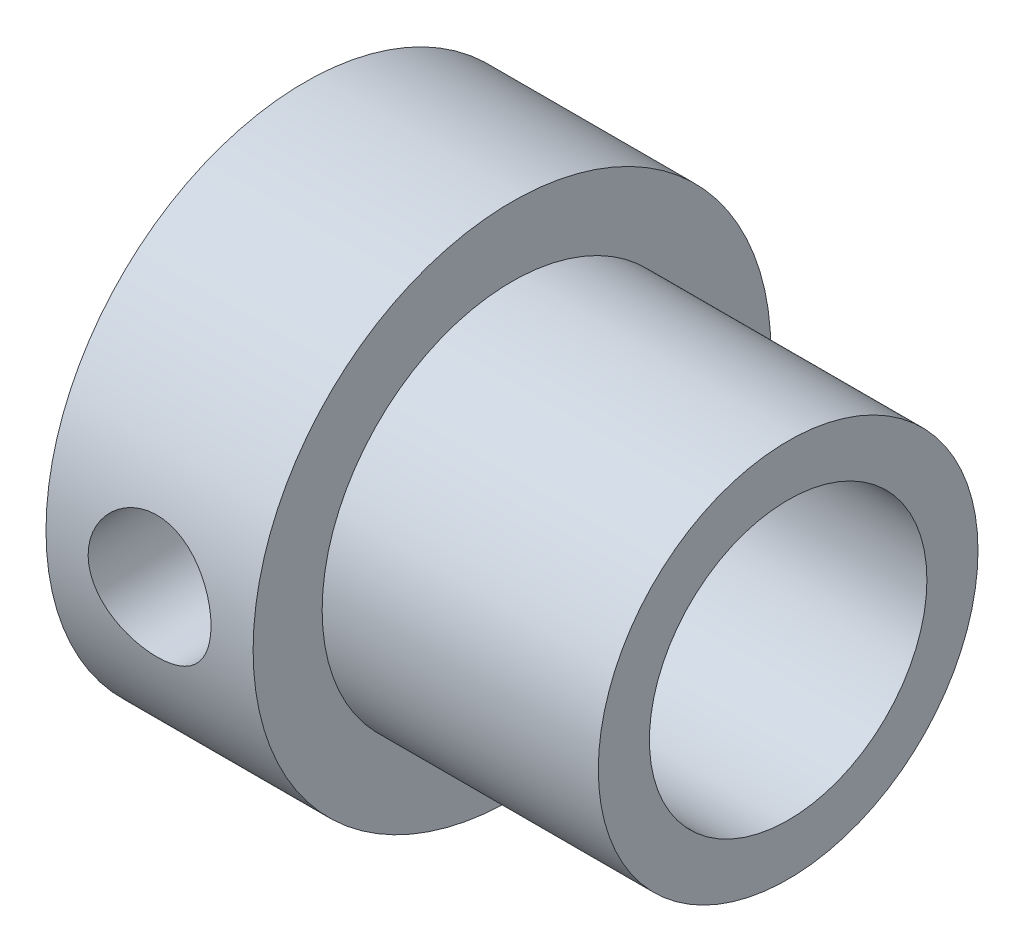
ISO-10303-21;
HEADER;
FILE_DESCRIPTION(('STEP AP214'),'2;1');
FILE_NAME('part.step','',(''),(''),'','','');
FILE_SCHEMA(('AUTOMOTIVE_DESIGN { 1 0 10303 214 1 1 1 1 }'));
ENDSEC;
DATA;
#1=APPLICATION_CONTEXT('core data for automotive mechanical design processes');
#2=APPLICATION_PROTOCOL_DEFINITION('international standard','automotive_design',2000,#1);
#3=PRODUCT_CONTEXT('',#1,'mechanical');
#4=PRODUCT('Part','Part','',(#3));
#5=PRODUCT_RELATED_PRODUCT_CATEGORY('part','',(#4));
#6=PRODUCT_DEFINITION_FORMATION('','',#4);
#7=PRODUCT_DEFINITION_CONTEXT('part definition',#1,'design');
#8=PRODUCT_DEFINITION('design','',#6,#7);
#9=PRODUCT_DEFINITION_SHAPE('','',#8);
#10=(LENGTH_UNIT() NAMED_UNIT(*) SI_UNIT(.MILLI.,.METRE.));
#11=(NAMED_UNIT(*) PLANE_ANGLE_UNIT() SI_UNIT($,.RADIAN.));
#12=(NAMED_UNIT(*) SI_UNIT($,.STERADIAN.) SOLID_ANGLE_UNIT());
#13=UNCERTAINTY_MEASURE_WITH_UNIT(LENGTH_MEASURE(1.E-05),#10,'distance_accuracy_value','');
#14=(GEOMETRIC_REPRESENTATION_CONTEXT(3) GLOBAL_UNCERTAINTY_ASSIGNED_CONTEXT((#13)) GLOBAL_UNIT_ASSIGNED_CONTEXT((#10,
#11,#12)) REPRESENTATION_CONTEXT('',''));
#15=CARTESIAN_POINT('',(0.,0.,0.));
#16=DIRECTION('',(0.,0.,1.));
#17=DIRECTION('',(1.,0.,0.));
#18=AXIS2_PLACEMENT_3D('',#15,#16,#17);
#19=CARTESIAN_POINT('',(8.89,0.,0.));
#20=DIRECTION('',(1.,0.,0.));
#21=DIRECTION('',(0.,0.,-1.));
#22=AXIS2_PLACEMENT_3D('',#19,#20,#21);
#23=PLANE('',#22);
#24=CARTESIAN_POINT('',(8.89,0.,0.));
#25=DIRECTION('',(1.,0.,0.));
#26=DIRECTION('',(0.,0.,-1.));
#27=AXIS2_PLACEMENT_3D('',#24,#25,#26);
#28=CIRCLE('',#27,3.4925);
#29=CARTESIAN_POINT('',(8.89,0.,-3.4925));
#30=VERTEX_POINT('',#29);
#31=EDGE_CURVE('E109',#30,#30,#28,.T.);
#32=ORIENTED_EDGE('',*,*,#31,.T.);
#33=EDGE_LOOP('',(#32));
#34=FACE_BOUND('',#33,.T.);
#35=CARTESIAN_POINT('',(8.89,0.,0.));
#36=DIRECTION('',(1.,0.,0.));
#37=DIRECTION('',(0.,0.,-1.));
#38=AXIS2_PLACEMENT_3D('',#35,#36,#37);
#39=CIRCLE('',#38,2.5527);
#40=CARTESIAN_POINT('',(8.89,0.,-2.5527));
#41=VERTEX_POINT('',#40);
#42=EDGE_CURVE('E45',#41,#41,#39,.T.);
#43=ORIENTED_EDGE('',*,*,#42,.F.);
#44=EDGE_LOOP('',(#43));
#45=FACE_BOUND('',#44,.T.);
#46=ADVANCED_FACE('F33',(#34,#45),#23,.T.);
#47=CARTESIAN_POINT('',(0.,0.,0.));
#48=DIRECTION('',(1.,0.,0.));
#49=DIRECTION('',(0.,0.,-1.));
#50=AXIS2_PLACEMENT_3D('',#47,#48,#49);
#51=PLANE('',#50);
#52=CARTESIAN_POINT('',(0.,0.,0.));
#53=DIRECTION('',(1.,0.,0.));
#54=DIRECTION('',(0.,0.,-1.));
#55=AXIS2_PLACEMENT_3D('',#52,#53,#54);
#56=CIRCLE('',#55,4.7625);
#57=CARTESIAN_POINT('',(0.,0.,-4.7625));
#58=VERTEX_POINT('',#57);
#59=EDGE_CURVE('E10',#58,#58,#56,.T.);
#60=ORIENTED_EDGE('',*,*,#59,.F.);
#61=EDGE_LOOP('',(#60));
#62=FACE_BOUND('',#61,.T.);
#63=CARTESIAN_POINT('',(0.,0.,0.));
#64=DIRECTION('',(1.,0.,0.));
#65=DIRECTION('',(0.,0.,-1.));
#66=AXIS2_PLACEMENT_3D('',#63,#64,#65);
#67=CIRCLE('',#66,2.5527);
#68=CARTESIAN_POINT('',(0.,0.,-2.5527));
#69=VERTEX_POINT('',#68);
#70=EDGE_CURVE('E50',#69,#69,#67,.T.);
#71=ORIENTED_EDGE('',*,*,#70,.T.);
#72=EDGE_LOOP('',(#71));
#73=FACE_BOUND('',#72,.T.);
#74=ADVANCED_FACE('F100',(#62,#73),#51,.F.);
#75=CARTESIAN_POINT('',(8.89,0.,0.));
#76=DIRECTION('',(-1.,0.,0.));
#77=DIRECTION('',(0.,0.,1.));
#78=AXIS2_PLACEMENT_3D('',#75,#76,#77);
#79=CYLINDRICAL_SURFACE('',#78,4.7625);
#80=CARTESIAN_POINT('',(3.03529999999999,0.,4.7625));
#81=CARTESIAN_POINT('',(3.03529807239149,-0.0625504471650139,4.76249888658254));
#82=CARTESIAN_POINT('',(3.03009021829286,-0.125123129283414,4.76125531619252));
#83=CARTESIAN_POINT('',(3.00942356035693,-0.248481844038287,4.75641479439014));
#84=CARTESIAN_POINT('',(2.99395831147164,-0.309266728250472,4.75281636336277));
#85=CARTESIAN_POINT('',(2.95329586247846,-0.427250047842575,4.74366551356278));
#86=CARTESIAN_POINT('',(2.92810971725876,-0.484452471724355,4.73811531503235));
#87=CARTESIAN_POINT('',(2.86875774840629,-0.593819309373723,4.72565533763748));
#88=CARTESIAN_POINT('',(2.83459184246671,-0.645983676957435,4.71874554631142));
#89=CARTESIAN_POINT('',(2.75757488787853,-0.744769781920514,4.70417494660862));
#90=CARTESIAN_POINT('',(2.7145877648823,-0.791283867055914,4.69650348465821));
#91=CARTESIAN_POINT('',(2.62144029184914,-0.876514301242979,4.68134670992166));
#92=CARTESIAN_POINT('',(2.57127920799906,-0.915229851617912,4.67386141627044));
#93=CARTESIAN_POINT('',(2.4643886022683,-0.984257303274572,4.65981813018725));
#94=CARTESIAN_POINT('',(2.40758094945983,-1.01445122919643,4.6532737183417));
#95=CARTESIAN_POINT('',(2.28951628766717,-1.06482048280172,4.64200756588757));
#96=CARTESIAN_POINT('',(2.22825991492552,-1.08499723988878,4.63728556525076));
#97=CARTESIAN_POINT('',(2.10421390336463,-1.1143969583754,4.63030798184956));
#98=CARTESIAN_POINT('',(2.04147233950669,-1.12381226659384,4.62800914824604));
#99=CARTESIAN_POINT('',(1.91526132355056,-1.1320205269598,4.62600854277725));
#100=CARTESIAN_POINT('',(1.8517919788854,-1.1308150272652,4.62630639240253));
#101=CARTESIAN_POINT('',(1.72738235124524,-1.11796991019263,4.62942650333921));
#102=CARTESIAN_POINT('',(1.66641706945381,-1.10655703472154,4.63219390421103));
#103=CARTESIAN_POINT('',(1.54729209319917,-1.07398179717215,4.63985416565765));
#104=CARTESIAN_POINT('',(1.4891325811751,-1.05281880205468,4.64474716423846));
#105=CARTESIAN_POINT('',(1.3766497691327,-1.00114461591173,4.65615920388045));
#106=CARTESIAN_POINT('',(1.32236675088252,-0.970549092235659,4.66269281104616));
#107=CARTESIAN_POINT('',(1.21962280407758,-0.900937448372102,4.6766413798207));
#108=CARTESIAN_POINT('',(1.1711628026646,-0.861919990000867,4.68405648140832));
#109=CARTESIAN_POINT('',(1.08013848903166,-0.775386694919819,4.69916539760802));
#110=CARTESIAN_POINT('',(1.03775685037753,-0.727678881710187,4.70686148789115));
#111=CARTESIAN_POINT('',(0.961563027387468,-0.625742654598686,4.72149336042034));
#112=CARTESIAN_POINT('',(0.927751056466081,-0.571514078356698,4.72842912372918));
#113=CARTESIAN_POINT('',(0.869598634956746,-0.457830918707979,4.7407880498009));
#114=CARTESIAN_POINT('',(0.84528543817999,-0.398361889110949,4.7462068476709));
#115=CARTESIAN_POINT('',(0.80705015590794,-0.276024255491213,4.75488931700387));
#116=CARTESIAN_POINT('',(0.793126284237203,-0.21315623783065,4.75815335891022));
#117=CARTESIAN_POINT('',(0.776338279169921,-0.0873691590361518,4.76210460266796));
#118=CARTESIAN_POINT('',(0.773225069078427,-0.02448511596067,4.76284982691246));
#119=CARTESIAN_POINT('',(0.777466989421545,0.100904914262536,4.76184360723796));
#120=CARTESIAN_POINT('',(0.784821276170571,0.16341093147156,4.76009236453545));
#121=CARTESIAN_POINT('',(0.809583534682482,0.285421966304748,4.75432693440289));
#122=CARTESIAN_POINT('',(0.826857821394571,0.344955665814232,4.75034285425274));
#123=CARTESIAN_POINT('',(0.870818845652645,0.460278770394102,4.74055923690497));
#124=CARTESIAN_POINT('',(0.897506476042742,0.516067819691336,4.73475952750301));
#125=CARTESIAN_POINT('',(0.960034462531483,0.623325436186186,4.72184709836335));
#126=CARTESIAN_POINT('',(0.996017197145451,0.674708549514258,4.71471447952687));
#127=CARTESIAN_POINT('',(1.07592972675077,0.770796159921666,4.69996242077331));
#128=CARTESIAN_POINT('',(1.11986075028937,0.815499622590926,4.69234290571582));
#129=CARTESIAN_POINT('',(1.2155741125064,0.897968165505122,4.6772704338935));
#130=CARTESIAN_POINT('',(1.2675076328207,0.935559392964989,4.66982480514445));
#131=CARTESIAN_POINT('',(1.37709495613261,1.00149022808019,4.65613164810589));
#132=CARTESIAN_POINT('',(1.43474850300898,1.0298302497261,4.64988406620905));
#133=CARTESIAN_POINT('',(1.55382459697879,1.0762491323619,4.63935996173661));
#134=CARTESIAN_POINT('',(1.61522255286585,1.09438832132569,4.63507187952516));
#135=CARTESIAN_POINT('',(1.74031220674057,1.12005827002545,4.62893650286401));
#136=CARTESIAN_POINT('',(1.80400345879796,1.12759108086312,4.62708873650105));
#137=CARTESIAN_POINT('',(1.93010978036334,1.13173541942954,4.62607660378741));
#138=CARTESIAN_POINT('',(1.9925153584529,1.12862381464115,4.62684420801562));
#139=CARTESIAN_POINT('',(2.11588506708796,1.11219513075476,4.63082047949845));
#140=CARTESIAN_POINT('',(2.17684922125018,1.09887821898312,4.63402910673));
#141=CARTESIAN_POINT('',(2.29533856889195,1.06256106322214,4.64248992098927));
#142=CARTESIAN_POINT('',(2.35287894380876,1.03960787796392,4.64773216751233));
#143=CARTESIAN_POINT('',(2.46333073212595,0.984707919621938,4.65967190423071));
#144=CARTESIAN_POINT('',(2.51624156713508,0.95276002488178,4.66636957589639));
#145=CARTESIAN_POINT('',(2.61728172085009,0.879888490013,4.68066337542781));
#146=CARTESIAN_POINT('',(2.66526843242637,0.83877051437427,4.68827700003745));
#147=CARTESIAN_POINT('',(2.75375116750188,0.749111183772152,4.7034351287937));
#148=CARTESIAN_POINT('',(2.79424543377222,0.700568092234966,4.71097961633199));
#149=CARTESIAN_POINT('',(2.86721635688837,0.596506539598589,4.72529205111388));
#150=CARTESIAN_POINT('',(2.89955551187321,0.540889568123418,4.73204576758136));
#151=CARTESIAN_POINT('',(2.95437395279317,0.424856108392295,4.74386898028089));
#152=CARTESIAN_POINT('',(2.97686081846655,0.364443352132297,4.74893977052069));
#153=CARTESIAN_POINT('',(3.00771353998029,0.253386137402228,4.75601012346783));
#154=CARTESIAN_POINT('',(3.01803723707078,0.203302998812327,4.75842781496556));
#155=CARTESIAN_POINT('',(3.03183104555365,0.102151476578724,4.76167315947544));
#156=CARTESIAN_POINT('',(3.03530157422248,0.051083153112265,4.76250090929605));
#157=CARTESIAN_POINT('',(3.03529999999999,0.,4.7625));
#158=B_SPLINE_CURVE_WITH_KNOTS('',3,(#80,#81,#82,#83,#84,#85,#86,#87,#88,#89,#90,#91,#92,#93,
#94,#95,#96,#97,#98,#99,#100,#101,#102,#103,#104,#105,#106,#107,#108,#109,#110,#111,#112,#113,
#114,#115,#116,#117,#118,#119,#120,#121,#122,#123,#124,#125,#126,#127,#128,#129,#130,#131,#132,
#133,#134,#135,#136,#137,#138,#139,#140,#141,#142,#143,#144,#145,#146,#147,#148,#149,#150,#151,
#152,#153,#154,#155,#156,#157),.UNSPECIFIED.,.T.,.F.,(4,2,2,2,2,2,2,2,2,2,2,2,2,2,2,2,2,2,2,2,2,
2,2,2,2,2,2,2,2,2,2,2,2,2,2,2,2,2,4),(0.,0.187464233445307,0.375046368371232,0.562415804978716,
0.749786959039261,0.940301149532551,1.13083484137834,1.323889669599,1.51691694186556,
1.7064373300301,1.8959300929301,2.08131531006456,2.26671256527164,2.45381796865748,
2.64095312363525,2.83287860741466,3.02480887033708,3.21728584337237,3.40972971734638,
3.59770916783964,3.78567346795126,3.97116223372721,4.15666859761833,4.34520498082454,
4.53377053056521,4.72647545534146,4.91917175540808,5.1107161261548,5.30222345023355,
5.48878783947732,5.67534916987397,5.86100983556768,6.04669366374171,6.23676713117165,
6.42688512083306,6.62002158350616,6.81300919697149,6.96611517316011,7.11921182672834),.UNSPECIFIED.);
#159=CARTESIAN_POINT('',(3.03529999999999,0.,4.7625));
#160=VERTEX_POINT('',#159);
#161=EDGE_CURVE('E87',#160,#160,#158,.T.);
#162=ORIENTED_EDGE('',*,*,#161,.T.);
#163=EDGE_LOOP('',(#162));
#164=FACE_BOUND('',#163,.T.);
#165=CARTESIAN_POINT('',(1.905,-3.3214430575241,-3.413125));
#166=CARTESIAN_POINT('',(1.92239034401591,-3.32144338598432,-3.41312464634439));
#167=CARTESIAN_POINT('',(1.9397787414522,-3.32026081542799,-3.41427666636538));
#168=CARTESIAN_POINT('',(1.97395400258613,-3.31562276717464,-3.41878078138937));
#169=CARTESIAN_POINT('',(1.99074066982091,-3.31216655414177,-3.42213358816465));
#170=CARTESIAN_POINT('',(2.02312767048979,-3.30324677602216,-3.43074401766534));
#171=CARTESIAN_POINT('',(2.03873448716385,-3.29779531617929,-3.43599015088018));
#172=CARTESIAN_POINT('',(2.06858387778067,-3.28518677251326,-3.44804731415635));
#173=CARTESIAN_POINT('',(2.08282578029641,-3.27802885522817,-3.45485910885403));
#174=CARTESIAN_POINT('',(2.11509105279419,-3.25923213384868,-3.47261232738866));
#175=CARTESIAN_POINT('',(2.13241515241901,-3.24693568967856,-3.4841269595581));
#176=CARTESIAN_POINT('',(2.16414193459527,-3.22032780613654,-3.50873567923749));
#177=CARTESIAN_POINT('',(2.17853858438573,-3.20601230670761,-3.52183294141597));
#178=CARTESIAN_POINT('',(2.21034476020084,-3.16923494255587,-3.55502540489891));
#179=CARTESIAN_POINT('',(2.22626746028777,-3.14597187285453,-3.57565216335787));
#180=CARTESIAN_POINT('',(2.25310837678037,-3.09745752188421,-3.61776249375936));
#181=CARTESIAN_POINT('',(2.26401746715057,-3.07220271223861,-3.63924755139315));
#182=CARTESIAN_POINT('',(2.28583423970741,-3.00758272579165,-3.69301687162644));
#183=CARTESIAN_POINT('',(2.29408438772789,-2.96740471084196,-3.7253980082838));
#184=CARTESIAN_POINT('',(2.30263692602349,-2.88548985832329,-3.78920445830923));
#185=CARTESIAN_POINT('',(2.30292417041481,-2.84375020132706,-3.82062783664003));
#186=CARTESIAN_POINT('',(2.29640051141597,-2.75790125668795,-3.88308103972661));
#187=CARTESIAN_POINT('',(2.28929803326688,-2.71376498858693,-3.91404187778891));
#188=CARTESIAN_POINT('',(2.26795418822904,-2.62572112101903,-3.97363922110816));
#189=CARTESIAN_POINT('',(2.25372479737792,-2.58181326237924,-4.00227953228438));
#190=CARTESIAN_POINT('',(2.22466821562537,-2.51235877410809,-4.0460387951184));
#191=CARTESIAN_POINT('',(2.21225860599925,-2.4863570900501,-4.06205964259837));
#192=CARTESIAN_POINT('',(2.18417872092098,-2.43533400341371,-4.09285187028729));
#193=CARTESIAN_POINT('',(2.16850852246134,-2.41031257770499,-4.10762327998772));
#194=CARTESIAN_POINT('',(2.13789186319249,-2.36858809838528,-4.1317811950879));
#195=CARTESIAN_POINT('',(2.12386057879948,-2.35144207234751,-4.141555266608));
#196=CARTESIAN_POINT('',(2.0931996743799,-2.31888511543925,-4.15987045320255));
#197=CARTESIAN_POINT('',(2.0765769733352,-2.30346974706477,-4.16841473817517));
#198=CARTESIAN_POINT('',(2.0479262784848,-2.28157672142087,-4.18041850455823));
#199=CARTESIAN_POINT('',(2.03694193150532,-2.27408228589597,-4.18449710237343));
#200=CARTESIAN_POINT('',(2.0138689691845,-2.26051411574797,-4.191842221902));
#201=CARTESIAN_POINT('',(2.00178183687321,-2.2544385111243,-4.19510981287288));
#202=CARTESIAN_POINT('',(1.97882784387124,-2.24514191127608,-4.20009131246604));
#203=CARTESIAN_POINT('',(1.96812893569308,-2.24160480758647,-4.20197852141112));
#204=CARTESIAN_POINT('',(1.94621185847569,-2.23615061096609,-4.20488364068707));
#205=CARTESIAN_POINT('',(1.93499431005452,-2.23423163209288,-4.20590256303033));
#206=CARTESIAN_POINT('',(1.91228731464648,-2.23221846165825,-4.20697141450907));
#207=CARTESIAN_POINT('',(1.90079677635363,-2.23213358423556,-4.20701639768018));
#208=CARTESIAN_POINT('',(1.87799192992963,-2.23382269614555,-4.20611973060678));
#209=CARTESIAN_POINT('',(1.86667772808199,-2.23559776565571,-4.2051775070349));
#210=CARTESIAN_POINT('',(1.8430687481648,-2.24115748687566,-4.20221730298505));
#211=CARTESIAN_POINT('',(1.8308474995612,-2.24518086438047,-4.20007138390426));
#212=CARTESIAN_POINT('',(1.80731134338365,-2.25491349165417,-4.19485421354974));
#213=CARTESIAN_POINT('',(1.7959981005701,-2.26062575196372,-4.19178130966645));
#214=CARTESIAN_POINT('',(1.76849574876853,-2.27671571372701,-4.18307219674323));
#215=CARTESIAN_POINT('',(1.75296816247342,-2.28794796868523,-4.17694740443182));
#216=CARTESIAN_POINT('',(1.72398691235816,-2.31223528905542,-4.16355252146381));
#217=CARTESIAN_POINT('',(1.7105388805811,-2.32529512819918,-4.15627942479059));
#218=CARTESIAN_POINT('',(1.67465444619536,-2.36419280830635,-4.13434768281549));
#219=CARTESIAN_POINT('',(1.65435143115705,-2.39141722848185,-4.11868673816691));
#220=CARTESIAN_POINT('',(1.61829458416809,-2.44766595387083,-4.08551334686455));
#221=CARTESIAN_POINT('',(1.60255407385912,-2.47669523510611,-4.06799567831147));
#222=CARTESIAN_POINT('',(1.57719686465704,-2.53075747491538,-4.03453945113107));
#223=CARTESIAN_POINT('',(1.56699765373351,-2.55565573285649,-4.01882009430176));
#224=CARTESIAN_POINT('',(1.5490557045636,-2.60577429844982,-3.9865071967658));
#225=CARTESIAN_POINT('',(1.54131456525801,-2.63099480467137,-3.96991309519857));
#226=CARTESIAN_POINT('',(1.5216384028753,-2.70680859236329,-3.91896428365634));
#227=CARTESIAN_POINT('',(1.51323665727136,-2.75758517173021,-3.88342397257778));
#228=CARTESIAN_POINT('',(1.50701328930841,-2.8493816765294,-3.81642390743077));
#229=CARTESIAN_POINT('',(1.50761050886178,-2.8905675123375,-3.78532431891019));
#230=CARTESIAN_POINT('',(1.51664373656484,-2.97135732556234,-3.72223602539841));
#231=CARTESIAN_POINT('',(1.52505896182396,-3.01096520670335,-3.69024989575659));
#232=CARTESIAN_POINT('',(1.54641988378006,-3.07299164027436,-3.63855811141447));
#233=CARTESIAN_POINT('',(1.55649582605072,-3.09630079649555,-3.61873179054424));
#234=CARTESIAN_POINT('',(1.58090739348323,-3.14125149129612,-3.5797796162485));
#235=CARTESIAN_POINT('',(1.59523825020348,-3.16289486269341,-3.5606530054744));
#236=CARTESIAN_POINT('',(1.62454647953806,-3.19859687841671,-3.52857067890691));
#237=CARTESIAN_POINT('',(1.63847119403741,-3.21320091475058,-3.51526563807507));
#238=CARTESIAN_POINT('',(1.66923964746582,-3.2404900455096,-3.49012500024243));
#239=CARTESIAN_POINT('',(1.68607881465219,-3.25317808793733,-3.4782871509156));
#240=CARTESIAN_POINT('',(1.71844497508146,-3.27331915694858,-3.45932562435078));
#241=CARTESIAN_POINT('',(1.73337090377999,-3.28130387234286,-3.45174531647719));
#242=CARTESIAN_POINT('',(1.7648227585606,-3.29537697193551,-3.43831230827551));
#243=CARTESIAN_POINT('',(1.78134765069539,-3.30146657098294,-3.43245850131426));
#244=CARTESIAN_POINT('',(1.81540099301617,-3.31129882501221,-3.42297429357845));
#245=CARTESIAN_POINT('',(1.83290969775609,-3.31507670747535,-3.4193105403625));
#246=CARTESIAN_POINT('',(1.86861327605329,-3.32014785738221,-3.41438684725993));
#247=CARTESIAN_POINT('',(1.88680770315243,-3.32144271391698,-3.41312536996438));
#248=CARTESIAN_POINT('',(1.905,-3.3214430575241,-3.413125));
#249=B_SPLINE_CURVE_WITH_KNOTS('',3,(#165,#166,#167,#168,#169,#170,#171,#172,#173,#174,#175,
#176,#177,#178,#179,#180,#181,#182,#183,#184,#185,#186,#187,#188,#189,#190,#191,#192,#193,#194,
#195,#196,#197,#198,#199,#200,#201,#202,#203,#204,#205,#206,#207,#208,#209,#210,#211,#212,#213,
#214,#215,#216,#217,#218,#219,#220,#221,#222,#223,#224,#225,#226,#227,#228,#229,#230,#231,#232,
#233,#234,#235,#236,#237,#238,#239,#240,#241,#242,#243,#244,#245,#246,#247,#248),.UNSPECIFIED.,
.T.,.F.,(4,2,2,2,2,2,2,2,2,2,2,2,2,2,2,2,2,2,2,2,2,2,2,2,2,2,2,2,2,2,2,2,2,2,2,2,2,2,2,2,2,4),
(0.,0.0520929257956746,0.10420270764563,0.156001440657767,0.207825525043841,0.279916403884979,
0.352154371590211,0.456365581665272,0.560765738380168,0.716687516045963,0.872905845262917,
1.03553061412887,1.19788302119736,1.29663890309776,1.39539245333346,1.46789144239799,
1.54020007639941,1.58182368656726,1.62339212378137,1.65753190155879,1.69163183383017,
1.72590489571195,1.76019787295745,1.79911553656464,1.83810299598666,1.89812002615789,
1.95829685587146,2.06987154766141,2.18176880817835,2.27512769486264,2.36854718636202,
2.55527039257444,2.7096356498369,2.86359172289491,2.95999283122121,3.05628630894216,
3.12856379054588,3.20072890532355,3.25616129003594,3.31155806671769,3.36608815907237,
3.42058334150617),.UNSPECIFIED.);
#250=CARTESIAN_POINT('',(1.905,-3.3214430575241,-3.413125));
#251=VERTEX_POINT('',#250);
#252=EDGE_CURVE('E38',#251,#251,#249,.T.);
#253=ORIENTED_EDGE('',*,*,#252,.T.);
#254=EDGE_LOOP('',(#253));
#255=FACE_BOUND('',#254,.T.);
#256=CARTESIAN_POINT('',(1.905,3.32144305752409,-3.413125));
#257=CARTESIAN_POINT('',(1.88760965598409,3.32144338598432,-3.41312464634439));
#258=CARTESIAN_POINT('',(1.8702212585478,3.32026081542799,-3.41427666636538));
#259=CARTESIAN_POINT('',(1.83604599741387,3.31562276717464,-3.41878078138937));
#260=CARTESIAN_POINT('',(1.81925933017909,3.31216655414177,-3.42213358816465));
#261=CARTESIAN_POINT('',(1.78687232951021,3.30324677602216,-3.43074401766534));
#262=CARTESIAN_POINT('',(1.77126551283615,3.29779531617929,-3.43599015088018));
#263=CARTESIAN_POINT('',(1.74141612221933,3.28518677251326,-3.44804731415635));
#264=CARTESIAN_POINT('',(1.72717421970359,3.27802885522817,-3.45485910885403));
#265=CARTESIAN_POINT('',(1.69490894720581,3.25923213384867,-3.47261232738866));
#266=CARTESIAN_POINT('',(1.67758484758099,3.24693568967856,-3.4841269595581));
#267=CARTESIAN_POINT('',(1.64585806540473,3.22032780613654,-3.50873567923749));
#268=CARTESIAN_POINT('',(1.63146141561426,3.20601230670761,-3.52183294141597));
#269=CARTESIAN_POINT('',(1.59965523979916,3.16923494255587,-3.55502540489891));
#270=CARTESIAN_POINT('',(1.58373253971223,3.14597187285453,-3.57565216335787));
#271=CARTESIAN_POINT('',(1.55689162321963,3.09745752188421,-3.61776249375936));
#272=CARTESIAN_POINT('',(1.54598253284942,3.07220271223861,-3.63924755139315));
#273=CARTESIAN_POINT('',(1.52416576029259,3.00758272579165,-3.69301687162645));
#274=CARTESIAN_POINT('',(1.51591561227211,2.96740471084196,-3.72539800828381));
#275=CARTESIAN_POINT('',(1.50736307397651,2.88548985832329,-3.78920445830924));
#276=CARTESIAN_POINT('',(1.50707582958519,2.84375020132706,-3.82062783664004));
#277=CARTESIAN_POINT('',(1.51359948858403,2.75790125668794,-3.88308103972662));
#278=CARTESIAN_POINT('',(1.52070196673312,2.71376498858692,-3.91404187778891));
#279=CARTESIAN_POINT('',(1.54204581177096,2.62572112101902,-3.97363922110817));
#280=CARTESIAN_POINT('',(1.55627520262209,2.58181326237923,-4.00227953228438));
#281=CARTESIAN_POINT('',(1.58533178437463,2.51235877410808,-4.04603879511841));
#282=CARTESIAN_POINT('',(1.59774139400075,2.48635709005009,-4.06205964259837));
#283=CARTESIAN_POINT('',(1.62582127907902,2.43533400341371,-4.09285187028729));
#284=CARTESIAN_POINT('',(1.64149147753867,2.41031257770499,-4.10762327998772));
#285=CARTESIAN_POINT('',(1.67210813680751,2.36858809838528,-4.1317811950879));
#286=CARTESIAN_POINT('',(1.68613942120053,2.35144207234751,-4.141555266608));
#287=CARTESIAN_POINT('',(1.7168003256201,2.31888511543925,-4.15987045320255));
#288=CARTESIAN_POINT('',(1.7334230266648,2.30346974706477,-4.16841473817517));
#289=CARTESIAN_POINT('',(1.7620737215152,2.28157672142087,-4.18041850455823));
#290=CARTESIAN_POINT('',(1.77305806849468,2.27408228589596,-4.18449710237343));
#291=CARTESIAN_POINT('',(1.79613103081549,2.26051411574797,-4.191842221902));
#292=CARTESIAN_POINT('',(1.80821816312678,2.25443851112429,-4.19510981287288));
#293=CARTESIAN_POINT('',(1.83117215612876,2.24514191127608,-4.20009131246604));
#294=CARTESIAN_POINT('',(1.84187106430692,2.24160480758646,-4.20197852141112));
#295=CARTESIAN_POINT('',(1.86378814152431,2.23615061096609,-4.20488364068707));
#296=CARTESIAN_POINT('',(1.87500568994548,2.23423163209288,-4.20590256303033));
#297=CARTESIAN_POINT('',(1.89771268535351,2.23221846165825,-4.20697141450907));
#298=CARTESIAN_POINT('',(1.90920322364637,2.23213358423556,-4.20701639768018));
#299=CARTESIAN_POINT('',(1.93200807007036,2.23382269614555,-4.20611973060678));
#300=CARTESIAN_POINT('',(1.94332227191801,2.23559776565571,-4.2051775070349));
#301=CARTESIAN_POINT('',(1.9669312518352,2.24115748687566,-4.20221730298505));
#302=CARTESIAN_POINT('',(1.97915250043879,2.24518086438047,-4.20007138390427));
#303=CARTESIAN_POINT('',(2.00268865661635,2.25491349165417,-4.19485421354974));
#304=CARTESIAN_POINT('',(2.01400189942989,2.26062575196372,-4.19178130966645));
#305=CARTESIAN_POINT('',(2.04150425123147,2.27671571372701,-4.18307219674323));
#306=CARTESIAN_POINT('',(2.05703183752657,2.28794796868523,-4.17694740443182));
#307=CARTESIAN_POINT('',(2.08601308764184,2.31223528905541,-4.16355252146382));
#308=CARTESIAN_POINT('',(2.0994611194189,2.32529512819918,-4.15627942479059));
#309=CARTESIAN_POINT('',(2.13534555380464,2.36419280830634,-4.1343476828155));
#310=CARTESIAN_POINT('',(2.15564856884294,2.39141722848185,-4.11868673816691));
#311=CARTESIAN_POINT('',(2.19170541583191,2.44766595387082,-4.08551334686455));
#312=CARTESIAN_POINT('',(2.20744592614088,2.47669523510611,-4.06799567831147));
#313=CARTESIAN_POINT('',(2.23280313534296,2.53075747491537,-4.03453945113108));
#314=CARTESIAN_POINT('',(2.24300234626648,2.55565573285648,-4.01882009430177));
#315=CARTESIAN_POINT('',(2.26094429543639,2.60577429844981,-3.9865071967658));
#316=CARTESIAN_POINT('',(2.26868543474199,2.63099480467136,-3.96991309519858));
#317=CARTESIAN_POINT('',(2.2883615971247,2.70680859236328,-3.91896428365634));
#318=CARTESIAN_POINT('',(2.29676334272864,2.7575851717302,-3.88342397257779));
#319=CARTESIAN_POINT('',(2.30298671069159,2.84938167652939,-3.81642390743078));
#320=CARTESIAN_POINT('',(2.30238949113822,2.89056751233749,-3.7853243189102));
#321=CARTESIAN_POINT('',(2.29335626343516,2.97135732556233,-3.72223602539841));
#322=CARTESIAN_POINT('',(2.28494103817604,3.01096520670334,-3.69024989575659));
#323=CARTESIAN_POINT('',(2.26358011621994,3.07299164027436,-3.63855811141447));
#324=CARTESIAN_POINT('',(2.25350417394928,3.09630079649554,-3.61873179054425));
#325=CARTESIAN_POINT('',(2.22909260651677,3.14125149129612,-3.5797796162485));
#326=CARTESIAN_POINT('',(2.21476174979653,3.1628948626934,-3.56065300547441));
#327=CARTESIAN_POINT('',(2.18545352046194,3.19859687841671,-3.52857067890691));
#328=CARTESIAN_POINT('',(2.17152880596259,3.21320091475058,-3.51526563807507));
#329=CARTESIAN_POINT('',(2.14076035253418,3.24049004550959,-3.49012500024244));
#330=CARTESIAN_POINT('',(2.12392118534781,3.25317808793732,-3.4782871509156));
#331=CARTESIAN_POINT('',(2.09155502491854,3.27331915694857,-3.45932562435078));
#332=CARTESIAN_POINT('',(2.07662909622001,3.28130387234286,-3.45174531647719));
#333=CARTESIAN_POINT('',(2.0451772414394,3.29537697193551,-3.43831230827551));
#334=CARTESIAN_POINT('',(2.02865234930461,3.30146657098294,-3.43245850131426));
#335=CARTESIAN_POINT('',(1.99459900698383,3.31129882501221,-3.42297429357845));
#336=CARTESIAN_POINT('',(1.97709030224392,3.31507670747535,-3.4193105403625));
#337=CARTESIAN_POINT('',(1.94138672394671,3.32014785738221,-3.41438684725993));
#338=CARTESIAN_POINT('',(1.92319229684757,3.32144271391698,-3.41312536996438));
#339=CARTESIAN_POINT('',(1.905,3.32144305752409,-3.413125));
#340=B_SPLINE_CURVE_WITH_KNOTS('',3,(#256,#257,#258,#259,#260,#261,#262,#263,#264,#265,#266,
#267,#268,#269,#270,#271,#272,#273,#274,#275,#276,#277,#278,#279,#280,#281,#282,#283,#284,#285,
#286,#287,#288,#289,#290,#291,#292,#293,#294,#295,#296,#297,#298,#299,#300,#301,#302,#303,#304,
#305,#306,#307,#308,#309,#310,#311,#312,#313,#314,#315,#316,#317,#318,#319,#320,#321,#322,#323,
#324,#325,#326,#327,#328,#329,#330,#331,#332,#333,#334,#335,#336,#337,#338,#339),.UNSPECIFIED.,
.T.,.F.,(4,2,2,2,2,2,2,2,2,2,2,2,2,2,2,2,2,2,2,2,2,2,2,2,2,2,2,2,2,2,2,2,2,2,2,2,2,2,2,2,2,4),
(0.,0.0520929257956751,0.104202707645631,0.156001440657768,0.207825525043842,0.279916403884983,
0.352154371590214,0.456365581665275,0.560765738380173,0.71668751604597,0.872905845262925,
1.03553061412888,1.19788302119737,1.29663890309777,1.39539245333346,1.46789144239799,
1.54020007639941,1.58182368656726,1.62339212378137,1.65753190155879,1.69163183383017,
1.72590489571195,1.76019787295745,1.79911553656464,1.83810299598666,1.89812002615788,
1.95829685587146,2.0698715476614,2.18176880817834,2.27512769486263,2.36854718636201,
2.55527039257443,2.70963564983689,2.8635917228949,2.9599928312212,3.05628630894216,
3.12856379054588,3.20072890532355,3.25616129003594,3.31155806671769,3.36608815907237,
3.42058334150617),.UNSPECIFIED.);
#341=CARTESIAN_POINT('',(1.905,3.32144305752409,-3.413125));
#342=VERTEX_POINT('',#341);
#343=EDGE_CURVE('E53',#342,#342,#340,.T.);
#344=ORIENTED_EDGE('',*,*,#343,.T.);
#345=EDGE_LOOP('',(#344));
#346=FACE_BOUND('',#345,.T.);
#347=CARTESIAN_POINT('',(3.81,0.,0.));
#348=DIRECTION('',(1.,0.,0.));
#349=DIRECTION('',(0.,0.,-1.));
#350=AXIS2_PLACEMENT_3D('',#347,#348,#349);
#351=CIRCLE('',#350,4.7625);
#352=CARTESIAN_POINT('',(3.81,0.,-4.7625));
#353=VERTEX_POINT('',#352);
#354=EDGE_CURVE('E90',#353,#353,#351,.T.);
#355=ORIENTED_EDGE('',*,*,#354,.F.);
#356=EDGE_LOOP('',(#355));
#357=FACE_BOUND('',#356,.T.);
#358=ORIENTED_EDGE('',*,*,#59,.T.);
#359=EDGE_LOOP('',(#358));
#360=FACE_BOUND('',#359,.T.);
#361=ADVANCED_FACE('F35',(#164,#255,#346,#357,#360),#79,.T.);
#362=CARTESIAN_POINT('',(8.89,0.,0.));
#363=DIRECTION('',(-1.,0.,0.));
#364=DIRECTION('',(0.,0.,1.));
#365=AXIS2_PLACEMENT_3D('',#362,#363,#364);
#366=CYLINDRICAL_SURFACE('',#365,2.5527);
#367=CARTESIAN_POINT('',(3.03529999999999,0.,2.5527));
#368=CARTESIAN_POINT('',(3.03529282905714,-0.0602160567496059,2.55269448449947));
#369=CARTESIAN_POINT('',(3.03046021652438,-0.120508680051185,2.55054537847731));
#370=CARTESIAN_POINT('',(3.01131030547825,-0.23937014240754,2.54215493520172));
#371=CARTESIAN_POINT('',(2.99697009139083,-0.29793445873769,2.53590371124529));
#372=CARTESIAN_POINT('',(2.95945240965628,-0.411419374542606,2.51997666155683));
#373=CARTESIAN_POINT('',(2.93630637954421,-0.466352129460093,2.51031302714436));
#374=CARTESIAN_POINT('',(2.88197264558781,-0.571495506634322,2.48848497261423));
#375=CARTESIAN_POINT('',(2.85078681099267,-0.621707222831082,2.47632113392546));
#376=CARTESIAN_POINT('',(2.7794470951734,-0.718841057720421,2.4499396865557));
#377=CARTESIAN_POINT('',(2.7389198590514,-0.765468998996823,2.43564938328882));
#378=CARTESIAN_POINT('',(2.65084020850001,-0.851525278159022,2.40691591543445));
#379=CARTESIAN_POINT('',(2.60328366731766,-0.890949356201055,2.3924726657111));
#380=CARTESIAN_POINT('',(2.49920757105149,-0.9637179971063,2.36413569705502));
#381=CARTESIAN_POINT('',(2.44233091797509,-0.996585789381996,2.35032067415633));
#382=CARTESIAN_POINT('',(2.32316128864416,-1.05215699830398,2.32597723571994));
#383=CARTESIAN_POINT('',(2.2608714771474,-1.07486630690967,2.31544691611739));
#384=CARTESIAN_POINT('',(2.13602571007033,-1.10822240009857,2.29966233422319));
#385=CARTESIAN_POINT('',(2.07365445387615,-1.11943850820339,2.29416069195218));
#386=CARTESIAN_POINT('',(1.94769153303555,-1.1312603258457,2.28835651063992));
#387=CARTESIAN_POINT('',(1.88410070194496,-1.13187304082123,2.2880505389313));
#388=CARTESIAN_POINT('',(1.76353720679915,-1.12289554222307,2.29246572921488));
#389=CARTESIAN_POINT('',(1.70647782250948,-1.11420550394086,2.29674339361994));
#390=CARTESIAN_POINT('',(1.59473095191607,-1.08839383533707,2.30908609939515));
#391=CARTESIAN_POINT('',(1.54004399641201,-1.0712703286164,2.31715198360426));
#392=CARTESIAN_POINT('',(1.43313060060263,-1.02873855708971,2.33634905738901));
#393=CARTESIAN_POINT('',(1.3809866593155,-1.00315339171999,2.34754483168833));
#394=CARTESIAN_POINT('',(1.28151283505204,-0.944551655785948,2.37172992261126));
#395=CARTESIAN_POINT('',(1.23418498434827,-0.911531966760169,2.38471999097738));
#396=CARTESIAN_POINT('',(1.14087338495824,-0.835260954547335,2.41255392837845));
#397=CARTESIAN_POINT('',(1.09546125365245,-0.791329331334918,2.42745564854606));
#398=CARTESIAN_POINT('',(1.01244297431323,-0.696347496244407,2.45638779862968));
#399=CARTESIAN_POINT('',(0.97483915174324,-0.645295171231233,2.47041796811186));
#400=CARTESIAN_POINT('',(0.907514150341248,-0.535591698159593,2.49653458825907));
#401=CARTESIAN_POINT('',(0.878054399841689,-0.476762564050434,2.5085525409727));
#402=CARTESIAN_POINT('',(0.829655601779208,-0.35431452685626,2.52875031300777));
#403=CARTESIAN_POINT('',(0.810709971598754,-0.290698649025315,2.53693253328217));
#404=CARTESIAN_POINT('',(0.78514037718007,-0.165234242495203,2.54807038180377));
#405=CARTESIAN_POINT('',(0.777751102645015,-0.103570504592633,2.55134993299086));
#406=CARTESIAN_POINT('',(0.77318678957031,0.0201993143716165,2.55336929609543));
#407=CARTESIAN_POINT('',(0.776008316081458,0.0823052396643216,2.55211063468403));
#408=CARTESIAN_POINT('',(0.791264659845358,0.20142011698323,2.54540060091857));
#409=CARTESIAN_POINT('',(0.803136667951891,0.258516659530427,2.54019478351188));
#410=CARTESIAN_POINT('',(0.835344676055062,0.36982965186002,2.52639085908319));
#411=CARTESIAN_POINT('',(0.855681707392591,0.424045749793895,2.51779233871595));
#412=CARTESIAN_POINT('',(0.904891574996332,0.52998034717818,2.497678352363));
#413=CARTESIAN_POINT('',(0.93401103837299,0.581568058931795,2.48608021280823));
#414=CARTESIAN_POINT('',(0.999690367460261,0.679310979029163,2.46117086382426));
#415=CARTESIAN_POINT('',(1.03625346847085,0.725463811343834,2.44785891043166));
#416=CARTESIAN_POINT('',(1.11919292828089,0.814921424188227,2.41961842012819));
#417=CARTESIAN_POINT('',(1.16612054825016,0.857702454350473,2.40464577955967));
#418=CARTESIAN_POINT('',(1.26667704810093,0.934956436859525,2.37567672696775));
#419=CARTESIAN_POINT('',(1.32030823744189,0.969426513938813,2.36168065398544));
#420=CARTESIAN_POINT('',(1.43441346044755,1.02974882948237,2.33602174669254));
#421=CARTESIAN_POINT('',(1.49501596073191,1.05538589808261,2.32441960882188));
#422=CARTESIAN_POINT('',(1.62035920170491,1.09584833199836,2.30562363388826));
#423=CARTESIAN_POINT('',(1.68509586483623,1.11068417683717,2.29842552505011));
#424=CARTESIAN_POINT('',(1.81099207444923,1.12802137909669,2.28996279802537));
#425=CARTESIAN_POINT('',(1.87199295305909,1.13145732858907,2.28824903159469));
#426=CARTESIAN_POINT('',(1.99368367085936,1.12845693405371,2.28973051020984));
#427=CARTESIAN_POINT('',(2.05437357239419,1.12202265324646,2.29292472931667));
#428=CARTESIAN_POINT('',(2.16998362720696,1.10028083498637,2.30343009671453));
#429=CARTESIAN_POINT('',(2.22503254282579,1.08552189362493,2.31048597855734));
#430=CARTESIAN_POINT('',(2.33186725790354,1.04812593319135,2.3276878118957));
#431=CARTESIAN_POINT('',(2.383652110642,1.02548664077961,2.33783465497243));
#432=CARTESIAN_POINT('',(2.48611134797336,0.971317490946336,2.36087637734785));
#433=CARTESIAN_POINT('',(2.5365034846531,0.939312091147947,2.37390539452386));
#434=CARTESIAN_POINT('',(2.63149227143436,0.867939935745815,2.40091913318218));
#435=CARTESIAN_POINT('',(2.67608651103002,0.828570134837967,2.41490424850371));
#436=CARTESIAN_POINT('',(2.76219981425414,0.73955681097959,2.4437068227117));
#437=CARTESIAN_POINT('',(2.80311860884599,0.689318993036078,2.45849155075447));
#438=CARTESIAN_POINT('',(2.87600624916051,0.582170143046457,2.48604326409856));
#439=CARTESIAN_POINT('',(2.90797101285694,0.525256084108887,2.4988093279659));
#440=CARTESIAN_POINT('',(2.96149446389384,0.406899945626086,2.52077180817792));
#441=CARTESIAN_POINT('',(2.98317038842847,0.345518551027845,2.5300081950329));
#442=CARTESIAN_POINT('',(3.01565897686328,0.21958188199227,2.54402085831063));
#443=CARTESIAN_POINT('',(3.02650483510197,0.155036945904379,2.54881076009149));
#444=CARTESIAN_POINT('',(3.03410460993957,0.0601017931651447,2.55217130197994));
#445=CARTESIAN_POINT('',(3.03530357980393,0.0300604371686475,2.55270275339114));
#446=CARTESIAN_POINT('',(3.03529999999999,0.,2.5527));
#447=B_SPLINE_CURVE_WITH_KNOTS('',3,(#367,#368,#369,#370,#371,#372,#373,#374,#375,#376,#377,
#378,#379,#380,#381,#382,#383,#384,#385,#386,#387,#388,#389,#390,#391,#392,#393,#394,#395,#396,
#397,#398,#399,#400,#401,#402,#403,#404,#405,#406,#407,#408,#409,#410,#411,#412,#413,#414,#415,
#416,#417,#418,#419,#420,#421,#422,#423,#424,#425,#426,#427,#428,#429,#430,#431,#432,#433,#434,
#435,#436,#437,#438,#439,#440,#441,#442,#443,#444,#445,#446),.UNSPECIFIED.,.T.,.F.,(4,2,2,2,2,2,
2,2,2,2,2,2,2,2,2,2,2,2,2,2,2,2,2,2,2,2,2,2,2,2,2,2,2,2,2,2,2,2,2,4),(0.,0.180554885238168,
0.36154654031981,0.541898012370026,0.722207590579876,0.911622809239033,1.10114967443266,
1.30151806770645,1.50177009538174,1.69153715612323,1.88117883698317,2.0539993725058,
2.22685837700418,2.40358744287254,2.58039077750935,2.77427558064035,2.96821804381108,
3.16780808586098,3.36727302839408,3.55286554906589,3.73839564156888,3.91324438209369,
4.088114431652,4.2684429987727,4.4488501118144,4.64369910251393,4.83861540699272,
5.03799041809897,5.23717173360048,5.41955749497925,5.60190513660251,5.77344361474746,
5.94503161972798,6.12758055811081,6.31020515110672,6.50863694233499,6.70715904935606,
6.90336128916694,7.09896030269651,7.18909504542407),.UNSPECIFIED.);
#448=CARTESIAN_POINT('',(3.03529999999999,0.,2.5527));
#449=VERTEX_POINT('',#448);
#450=EDGE_CURVE('E57',#449,#449,#447,.T.);
#451=ORIENTED_EDGE('',*,*,#450,.F.);
#452=EDGE_LOOP('',(#451));
#453=FACE_BOUND('',#452,.T.);
#454=ORIENTED_EDGE('',*,*,#42,.T.);
#455=EDGE_LOOP('',(#454));
#456=FACE_BOUND('',#455,.T.);
#457=ORIENTED_EDGE('',*,*,#70,.F.);
#458=EDGE_LOOP('',(#457));
#459=FACE_BOUND('',#458,.T.);
#460=ADVANCED_FACE('F75',(#453,#456,#459),#366,.F.);
#461=CARTESIAN_POINT('',(3.81,4.7625,0.));
#462=DIRECTION('',(-1.,0.,0.));
#463=DIRECTION('',(0.,0.,1.));
#464=AXIS2_PLACEMENT_3D('',#461,#462,#463);
#465=PLANE('',#464);
#466=CARTESIAN_POINT('',(3.81,0.,0.));
#467=DIRECTION('',(1.,0.,0.));
#468=DIRECTION('',(0.,0.,-1.));
#469=AXIS2_PLACEMENT_3D('',#466,#467,#468);
#470=CIRCLE('',#469,3.4925);
#471=CARTESIAN_POINT('',(3.81,0.,-3.4925));
#472=VERTEX_POINT('',#471);
#473=EDGE_CURVE('E116',#472,#472,#470,.T.);
#474=ORIENTED_EDGE('',*,*,#473,.F.);
#475=EDGE_LOOP('',(#474));
#476=FACE_BOUND('',#475,.T.);
#477=ORIENTED_EDGE('',*,*,#354,.T.);
#478=EDGE_LOOP('',(#477));
#479=FACE_BOUND('',#478,.T.);
#480=ADVANCED_FACE('F71',(#476,#479),#465,.F.);
#481=CARTESIAN_POINT('',(8.89,0.,0.));
#482=DIRECTION('',(1.,0.,0.));
#483=DIRECTION('',(0.,0.,-1.));
#484=AXIS2_PLACEMENT_3D('',#481,#482,#483);
#485=CYLINDRICAL_SURFACE('',#484,3.4925);
#486=ORIENTED_EDGE('',*,*,#31,.F.);
#487=EDGE_LOOP('',(#486));
#488=FACE_BOUND('',#487,.T.);
#489=ORIENTED_EDGE('',*,*,#473,.T.);
#490=EDGE_LOOP('',(#489));
#491=FACE_BOUND('',#490,.T.);
#492=ADVANCED_FACE('F64',(#488,#491),#485,.T.);
#493=CARTESIAN_POINT('',(1.905,-4.7625,-3.81));
#494=DIRECTION('',(0.,1.,0.));
#495=DIRECTION('',(0.,0.,1.));
#496=AXIS2_PLACEMENT_3D('',#493,#494,#495);
#497=CYLINDRICAL_SURFACE('',#496,0.396875);
#498=ORIENTED_EDGE('',*,*,#343,.F.);
#499=EDGE_LOOP('',(#498));
#500=FACE_BOUND('',#499,.T.);
#501=ORIENTED_EDGE('',*,*,#252,.F.);
#502=EDGE_LOOP('',(#501));
#503=FACE_BOUND('',#502,.T.);
#504=ADVANCED_FACE('F58',(#500,#503),#497,.F.);
#505=CARTESIAN_POINT('',(1.905,0.,0.));
#506=DIRECTION('',(0.,0.,-1.));
#507=DIRECTION('',(-1.,0.,0.));
#508=AXIS2_PLACEMENT_3D('',#505,#506,#507);
#509=CYLINDRICAL_SURFACE('',#508,1.13029999999999);
#510=ORIENTED_EDGE('',*,*,#450,.T.);
#511=EDGE_LOOP('',(#510));
#512=FACE_BOUND('',#511,.T.);
#513=ORIENTED_EDGE('',*,*,#161,.F.);
#514=EDGE_LOOP('',(#513));
#515=FACE_BOUND('',#514,.T.);
#516=ADVANCED_FACE('F63',(#512,#515),#509,.F.);
#517=CLOSED_SHELL('',(#46,#74,#361,#460,#480,#492,#504,#516));
#518=MANIFOLD_SOLID_BREP('B2',#517);
#519=ADVANCED_BREP_SHAPE_REPRESENTATION('',(#18,#518),#14);
#520=SHAPE_DEFINITION_REPRESENTATION(#9,#519);
ENDSEC;
END-ISO-10303-21;
